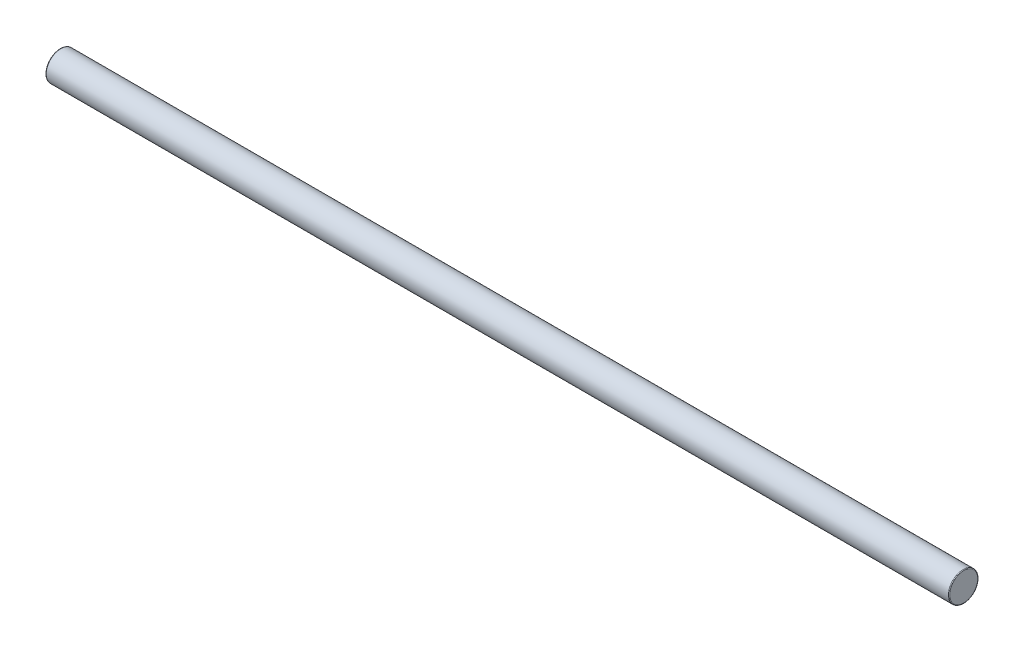
ISO-10303-21;
HEADER;
FILE_DESCRIPTION(('STEP AP214'),'2;1');
FILE_NAME('part.step','',(''),(''),'','','');
FILE_SCHEMA(('AUTOMOTIVE_DESIGN { 1 0 10303 214 1 1 1 1 }'));
ENDSEC;
DATA;
#1=APPLICATION_CONTEXT('core data for automotive mechanical design processes');
#2=APPLICATION_PROTOCOL_DEFINITION('international standard','automotive_design',2000,#1);
#3=PRODUCT_CONTEXT('',#1,'mechanical');
#4=PRODUCT('Part','Part','',(#3));
#5=PRODUCT_RELATED_PRODUCT_CATEGORY('part','',(#4));
#6=PRODUCT_DEFINITION_FORMATION('','',#4);
#7=PRODUCT_DEFINITION_CONTEXT('part definition',#1,'design');
#8=PRODUCT_DEFINITION('design','',#6,#7);
#9=PRODUCT_DEFINITION_SHAPE('','',#8);
#10=(LENGTH_UNIT() NAMED_UNIT(*) SI_UNIT(.MILLI.,.METRE.));
#11=(NAMED_UNIT(*) PLANE_ANGLE_UNIT() SI_UNIT($,.RADIAN.));
#12=(NAMED_UNIT(*) SI_UNIT($,.STERADIAN.) SOLID_ANGLE_UNIT());
#13=UNCERTAINTY_MEASURE_WITH_UNIT(LENGTH_MEASURE(1.E-05),#10,'distance_accuracy_value','');
#14=(GEOMETRIC_REPRESENTATION_CONTEXT(3) GLOBAL_UNCERTAINTY_ASSIGNED_CONTEXT((#13)) GLOBAL_UNIT_ASSIGNED_CONTEXT((#10,
#11,#12)) REPRESENTATION_CONTEXT('',''));
#15=CARTESIAN_POINT('',(0.,0.,0.));
#16=DIRECTION('',(0.,0.,1.));
#17=DIRECTION('',(1.,0.,0.));
#18=AXIS2_PLACEMENT_3D('',#15,#16,#17);
#19=CARTESIAN_POINT('',(1952.752,976.376,0.));
#20=DIRECTION('',(-1.,0.,0.));
#21=DIRECTION('',(0.,0.,1.));
#22=AXIS2_PLACEMENT_3D('',#19,#20,#21);
#23=CYLINDRICAL_SURFACE('',#22,31.7309500000001);
#24=CARTESIAN_POINT('',(1951.228,976.376,0.));
#25=DIRECTION('',(1.,0.,0.));
#26=DIRECTION('',(0.,0.,-1.));
#27=AXIS2_PLACEMENT_3D('',#24,#25,#26);
#28=CIRCLE('',#27,31.7309500000001);
#29=CARTESIAN_POINT('',(1951.228,976.376,-31.7309500000001));
#30=VERTEX_POINT('',#29);
#31=EDGE_CURVE('E44',#30,#30,#28,.F.);
#32=ORIENTED_EDGE('',*,*,#31,.T.);
#33=EDGE_LOOP('',(#32));
#34=FACE_BOUND('',#33,.T.);
#35=CARTESIAN_POINT('',(1.52400000000008,976.376,0.));
#36=DIRECTION('',(1.,0.,0.));
#37=DIRECTION('',(0.,0.,-1.));
#38=AXIS2_PLACEMENT_3D('',#35,#36,#37);
#39=CIRCLE('',#38,31.7309500000001);
#40=CARTESIAN_POINT('',(1.52400000000008,976.376,-31.7309500000001));
#41=VERTEX_POINT('',#40);
#42=EDGE_CURVE('E48',#41,#41,#39,.T.);
#43=ORIENTED_EDGE('',*,*,#42,.T.);
#44=EDGE_LOOP('',(#43));
#45=FACE_BOUND('',#44,.T.);
#46=ADVANCED_FACE('F37',(#34,#45),#23,.T.);
#47=CARTESIAN_POINT('',(1952.752,976.376,0.));
#48=DIRECTION('',(1.,0.,0.));
#49=DIRECTION('',(0.,0.,-1.));
#50=AXIS2_PLACEMENT_3D('',#47,#48,#49);
#51=PLANE('',#50);
#52=CARTESIAN_POINT('',(1952.752,976.376,0.));
#53=DIRECTION('',(1.,0.,0.));
#54=DIRECTION('',(0.,0.,-1.));
#55=AXIS2_PLACEMENT_3D('',#52,#53,#54);
#56=CIRCLE('',#55,30.2069500000001);
#57=CARTESIAN_POINT('',(1952.752,976.376,-30.2069500000001));
#58=VERTEX_POINT('',#57);
#59=EDGE_CURVE('E52',#58,#58,#56,.T.);
#60=ORIENTED_EDGE('',*,*,#59,.T.);
#61=EDGE_LOOP('',(#60));
#62=FACE_BOUND('',#61,.T.);
#63=ADVANCED_FACE('F58',(#62),#51,.T.);
#64=CARTESIAN_POINT('',(0.,976.376,0.));
#65=DIRECTION('',(1.,0.,0.));
#66=DIRECTION('',(0.,0.,-1.));
#67=AXIS2_PLACEMENT_3D('',#64,#65,#66);
#68=PLANE('',#67);
#69=CARTESIAN_POINT('',(0.,976.376,0.));
#70=DIRECTION('',(1.,0.,0.));
#71=DIRECTION('',(0.,0.,-1.));
#72=AXIS2_PLACEMENT_3D('',#69,#70,#71);
#73=CIRCLE('',#72,30.2069500000001);
#74=CARTESIAN_POINT('',(0.,976.376,-30.2069500000001));
#75=VERTEX_POINT('',#74);
#76=EDGE_CURVE('E10',#75,#75,#73,.F.);
#77=ORIENTED_EDGE('',*,*,#76,.T.);
#78=EDGE_LOOP('',(#77));
#79=FACE_BOUND('',#78,.T.);
#80=ADVANCED_FACE('F62',(#79),#68,.F.);
#81=CARTESIAN_POINT('',(1951.228,976.376,0.));
#82=DIRECTION('',(1.,0.,0.));
#83=DIRECTION('',(0.,0.,-1.));
#84=AXIS2_PLACEMENT_3D('',#81,#82,#83);
#85=TOROIDAL_SURFACE('',#84,30.2069500000001,1.524);
#86=ORIENTED_EDGE('',*,*,#31,.F.);
#87=EDGE_LOOP('',(#86));
#88=FACE_BOUND('',#87,.T.);
#89=ORIENTED_EDGE('',*,*,#59,.F.);
#90=EDGE_LOOP('',(#89));
#91=FACE_BOUND('',#90,.T.);
#92=ADVANCED_FACE('F60',(#88,#91),#85,.T.);
#93=CARTESIAN_POINT('',(1.52400000000008,976.376,0.));
#94=DIRECTION('',(1.,0.,0.));
#95=DIRECTION('',(0.,0.,-1.));
#96=AXIS2_PLACEMENT_3D('',#93,#94,#95);
#97=TOROIDAL_SURFACE('',#96,30.2069500000001,1.524);
#98=ORIENTED_EDGE('',*,*,#76,.F.);
#99=EDGE_LOOP('',(#98));
#100=FACE_BOUND('',#99,.T.);
#101=ORIENTED_EDGE('',*,*,#42,.F.);
#102=EDGE_LOOP('',(#101));
#103=FACE_BOUND('',#102,.T.);
#104=ADVANCED_FACE('F39',(#100,#103),#97,.T.);
#105=CLOSED_SHELL('',(#46,#63,#80,#92,#104));
#106=MANIFOLD_SOLID_BREP('B2',#105);
#107=ADVANCED_BREP_SHAPE_REPRESENTATION('',(#18,#106),#14);
#108=SHAPE_DEFINITION_REPRESENTATION(#9,#107);
ENDSEC;
END-ISO-10303-21;
